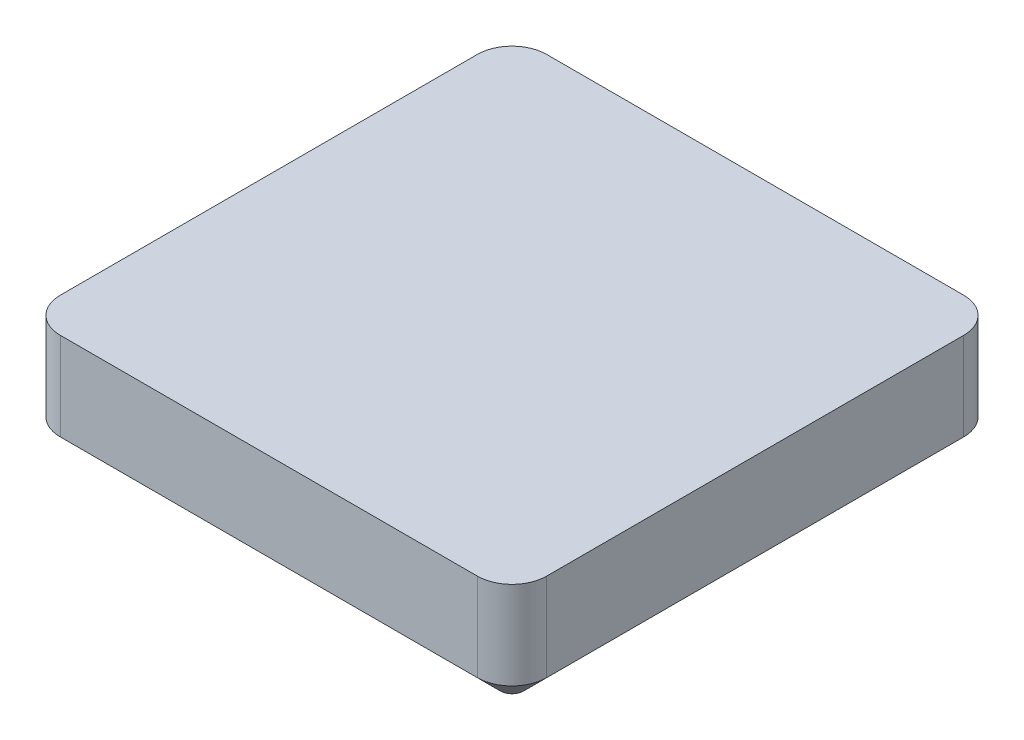
ISO-10303-21;
HEADER;
FILE_DESCRIPTION(('STEP AP214'),'2;1');
FILE_NAME('part.step','',(''),(''),'','','');
FILE_SCHEMA(('AUTOMOTIVE_DESIGN { 1 0 10303 214 1 1 1 1 }'));
ENDSEC;
DATA;
#1=APPLICATION_CONTEXT('core data for automotive mechanical design processes');
#2=APPLICATION_PROTOCOL_DEFINITION('international standard','automotive_design',2000,#1);
#3=PRODUCT_CONTEXT('',#1,'mechanical');
#4=PRODUCT('Part','Part','',(#3));
#5=PRODUCT_RELATED_PRODUCT_CATEGORY('part','',(#4));
#6=PRODUCT_DEFINITION_FORMATION('','',#4);
#7=PRODUCT_DEFINITION_CONTEXT('part definition',#1,'design');
#8=PRODUCT_DEFINITION('design','',#6,#7);
#9=PRODUCT_DEFINITION_SHAPE('','',#8);
#10=(LENGTH_UNIT() NAMED_UNIT(*) SI_UNIT(.MILLI.,.METRE.));
#11=(NAMED_UNIT(*) PLANE_ANGLE_UNIT() SI_UNIT($,.RADIAN.));
#12=(NAMED_UNIT(*) SI_UNIT($,.STERADIAN.) SOLID_ANGLE_UNIT());
#13=UNCERTAINTY_MEASURE_WITH_UNIT(LENGTH_MEASURE(1.E-05),#10,'distance_accuracy_value','');
#14=(GEOMETRIC_REPRESENTATION_CONTEXT(3) GLOBAL_UNCERTAINTY_ASSIGNED_CONTEXT((#13)) GLOBAL_UNIT_ASSIGNED_CONTEXT((#10,
#11,#12)) REPRESENTATION_CONTEXT('',''));
#15=CARTESIAN_POINT('',(0.,0.,0.));
#16=DIRECTION('',(0.,0.,1.));
#17=DIRECTION('',(1.,0.,0.));
#18=AXIS2_PLACEMENT_3D('',#15,#16,#17);
#19=CARTESIAN_POINT('',(0.,48.,0.));
#20=DIRECTION('',(1.,0.,0.));
#21=DIRECTION('',(0.,0.,-1.));
#22=AXIS2_PLACEMENT_3D('',#19,#20,#21);
#23=PLANE('',#22);
#24=DIRECTION('',(0.,-1.,0.));
#25=VECTOR('',#24,1.);
#26=CARTESIAN_POINT('',(0.,48.,15.));
#27=LINE('',#26,#25);
#28=CARTESIAN_POINT('',(0.,48.,15.));
#29=VERTEX_POINT('',#28);
#30=CARTESIAN_POINT('',(0.,9.99999999999998,15.));
#31=VERTEX_POINT('',#30);
#32=EDGE_CURVE('E138',#29,#31,#27,.T.);
#33=ORIENTED_EDGE('',*,*,#32,.T.);
#34=DIRECTION('',(0.,0.,1.));
#35=VECTOR('',#34,1.);
#36=CARTESIAN_POINT('',(0.,9.99999999999998,0.));
#37=LINE('',#36,#35);
#38=CARTESIAN_POINT('',(0.,9.99999999999998,195.));
#39=VERTEX_POINT('',#38);
#40=EDGE_CURVE('E11',#31,#39,#37,.T.);
#41=ORIENTED_EDGE('',*,*,#40,.T.);
#42=DIRECTION('',(0.,-1.,0.));
#43=VECTOR('',#42,1.);
#44=CARTESIAN_POINT('',(0.,48.,195.));
#45=LINE('',#44,#43);
#46=CARTESIAN_POINT('',(0.,48.,195.));
#47=VERTEX_POINT('',#46);
#48=EDGE_CURVE('E139',#39,#47,#45,.F.);
#49=ORIENTED_EDGE('',*,*,#48,.T.);
#50=DIRECTION('',(0.,0.,1.));
#51=VECTOR('',#50,1.);
#52=CARTESIAN_POINT('',(0.,48.,0.));
#53=LINE('',#52,#51);
#54=EDGE_CURVE('E131',#29,#47,#53,.T.);
#55=ORIENTED_EDGE('',*,*,#54,.F.);
#56=EDGE_LOOP('',(#33,#41,#49,#55));
#57=FACE_BOUND('',#56,.T.);
#58=ADVANCED_FACE('F35',(#57),#23,.F.);
#59=CARTESIAN_POINT('',(0.,48.,210.));
#60=DIRECTION('',(0.,0.,-1.));
#61=DIRECTION('',(-1.,0.,0.));
#62=AXIS2_PLACEMENT_3D('',#59,#60,#61);
#63=PLANE('',#62);
#64=DIRECTION('',(0.,-1.,0.));
#65=VECTOR('',#64,1.);
#66=CARTESIAN_POINT('',(15.,48.,210.));
#67=LINE('',#66,#65);
#68=CARTESIAN_POINT('',(15.,48.,210.));
#69=VERTEX_POINT('',#68);
#70=CARTESIAN_POINT('',(15.,9.99999999999998,210.));
#71=VERTEX_POINT('',#70);
#72=EDGE_CURVE('E161',#69,#71,#67,.T.);
#73=ORIENTED_EDGE('',*,*,#72,.T.);
#74=DIRECTION('',(1.,0.,0.));
#75=VECTOR('',#74,1.);
#76=CARTESIAN_POINT('',(0.,9.99999999999998,210.));
#77=LINE('',#76,#75);
#78=CARTESIAN_POINT('',(195.,9.99999999999998,210.));
#79=VERTEX_POINT('',#78);
#80=EDGE_CURVE('E192',#71,#79,#77,.T.);
#81=ORIENTED_EDGE('',*,*,#80,.T.);
#82=DIRECTION('',(0.,-1.,0.));
#83=VECTOR('',#82,1.);
#84=CARTESIAN_POINT('',(195.,48.,210.));
#85=LINE('',#84,#83);
#86=CARTESIAN_POINT('',(195.,48.,210.));
#87=VERTEX_POINT('',#86);
#88=EDGE_CURVE('E164',#79,#87,#85,.F.);
#89=ORIENTED_EDGE('',*,*,#88,.T.);
#90=DIRECTION('',(1.,0.,0.));
#91=VECTOR('',#90,1.);
#92=CARTESIAN_POINT('',(0.,48.,210.));
#93=LINE('',#92,#91);
#94=EDGE_CURVE('E140',#69,#87,#93,.T.);
#95=ORIENTED_EDGE('',*,*,#94,.F.);
#96=EDGE_LOOP('',(#73,#81,#89,#95));
#97=FACE_BOUND('',#96,.T.);
#98=ADVANCED_FACE('F257',(#97),#63,.F.);
#99=CARTESIAN_POINT('',(210.,48.,0.));
#100=DIRECTION('',(-1.,0.,0.));
#101=DIRECTION('',(0.,0.,1.));
#102=AXIS2_PLACEMENT_3D('',#99,#100,#101);
#103=PLANE('',#102);
#104=DIRECTION('',(0.,-1.,0.));
#105=VECTOR('',#104,1.);
#106=CARTESIAN_POINT('',(210.,48.,195.));
#107=LINE('',#106,#105);
#108=CARTESIAN_POINT('',(210.,48.,195.));
#109=VERTEX_POINT('',#108);
#110=CARTESIAN_POINT('',(210.,9.99999999999998,195.));
#111=VERTEX_POINT('',#110);
#112=EDGE_CURVE('E135',#109,#111,#107,.T.);
#113=ORIENTED_EDGE('',*,*,#112,.T.);
#114=DIRECTION('',(0.,0.,-1.));
#115=VECTOR('',#114,1.);
#116=CARTESIAN_POINT('',(210.,9.99999999999998,0.));
#117=LINE('',#116,#115);
#118=CARTESIAN_POINT('',(210.,9.99999999999998,15.));
#119=VERTEX_POINT('',#118);
#120=EDGE_CURVE('E166',#111,#119,#117,.T.);
#121=ORIENTED_EDGE('',*,*,#120,.T.);
#122=DIRECTION('',(0.,-1.,0.));
#123=VECTOR('',#122,1.);
#124=CARTESIAN_POINT('',(210.,48.,15.));
#125=LINE('',#124,#123);
#126=CARTESIAN_POINT('',(210.,48.,15.));
#127=VERTEX_POINT('',#126);
#128=EDGE_CURVE('E159',#119,#127,#125,.F.);
#129=ORIENTED_EDGE('',*,*,#128,.T.);
#130=DIRECTION('',(0.,0.,-1.));
#131=VECTOR('',#130,1.);
#132=CARTESIAN_POINT('',(210.,48.,0.));
#133=LINE('',#132,#131);
#134=EDGE_CURVE('E249',#109,#127,#133,.T.);
#135=ORIENTED_EDGE('',*,*,#134,.F.);
#136=EDGE_LOOP('',(#113,#121,#129,#135));
#137=FACE_BOUND('',#136,.T.);
#138=ADVANCED_FACE('F246',(#137),#103,.F.);
#139=CARTESIAN_POINT('',(0.,48.,0.));
#140=DIRECTION('',(0.,0.,1.));
#141=DIRECTION('',(1.,0.,0.));
#142=AXIS2_PLACEMENT_3D('',#139,#140,#141);
#143=PLANE('',#142);
#144=DIRECTION('',(0.,-1.,0.));
#145=VECTOR('',#144,1.);
#146=CARTESIAN_POINT('',(195.,48.,0.));
#147=LINE('',#146,#145);
#148=CARTESIAN_POINT('',(195.,48.,0.));
#149=VERTEX_POINT('',#148);
#150=CARTESIAN_POINT('',(195.,9.99999999999998,0.));
#151=VERTEX_POINT('',#150);
#152=EDGE_CURVE('E143',#149,#151,#147,.T.);
#153=ORIENTED_EDGE('',*,*,#152,.T.);
#154=DIRECTION('',(-1.,0.,0.));
#155=VECTOR('',#154,1.);
#156=CARTESIAN_POINT('',(0.,9.99999999999998,0.));
#157=LINE('',#156,#155);
#158=CARTESIAN_POINT('',(15.,9.99999999999998,0.));
#159=VERTEX_POINT('',#158);
#160=EDGE_CURVE('E190',#151,#159,#157,.T.);
#161=ORIENTED_EDGE('',*,*,#160,.T.);
#162=DIRECTION('',(0.,-1.,0.));
#163=VECTOR('',#162,1.);
#164=CARTESIAN_POINT('',(15.,48.,0.));
#165=LINE('',#164,#163);
#166=CARTESIAN_POINT('',(15.,48.,0.));
#167=VERTEX_POINT('',#166);
#168=EDGE_CURVE('E146',#159,#167,#165,.F.);
#169=ORIENTED_EDGE('',*,*,#168,.T.);
#170=DIRECTION('',(-1.,0.,0.));
#171=VECTOR('',#170,1.);
#172=CARTESIAN_POINT('',(0.,48.,0.));
#173=LINE('',#172,#171);
#174=EDGE_CURVE('E134',#149,#167,#173,.T.);
#175=ORIENTED_EDGE('',*,*,#174,.F.);
#176=EDGE_LOOP('',(#153,#161,#169,#175));
#177=FACE_BOUND('',#176,.T.);
#178=ADVANCED_FACE('F286',(#177),#143,.F.);
#179=CARTESIAN_POINT('',(0.,48.,0.));
#180=DIRECTION('',(0.,1.,0.));
#181=DIRECTION('',(0.,0.,1.));
#182=AXIS2_PLACEMENT_3D('',#179,#180,#181);
#183=PLANE('',#182);
#184=ORIENTED_EDGE('',*,*,#174,.T.);
#185=CARTESIAN_POINT('',(15.,48.,15.));
#186=DIRECTION('',(0.,1.,0.));
#187=DIRECTION('',(0.,0.,1.));
#188=AXIS2_PLACEMENT_3D('',#185,#186,#187);
#189=CIRCLE('',#188,15.);
#190=EDGE_CURVE('E128',#167,#29,#189,.T.);
#191=ORIENTED_EDGE('',*,*,#190,.T.);
#192=ORIENTED_EDGE('',*,*,#54,.T.);
#193=CARTESIAN_POINT('',(15.,48.,195.));
#194=DIRECTION('',(0.,1.,0.));
#195=DIRECTION('',(0.,0.,1.));
#196=AXIS2_PLACEMENT_3D('',#193,#194,#195);
#197=CIRCLE('',#196,15.);
#198=EDGE_CURVE('E152',#47,#69,#197,.T.);
#199=ORIENTED_EDGE('',*,*,#198,.T.);
#200=ORIENTED_EDGE('',*,*,#94,.T.);
#201=CARTESIAN_POINT('',(195.,48.,195.));
#202=DIRECTION('',(0.,1.,0.));
#203=DIRECTION('',(0.,0.,1.));
#204=AXIS2_PLACEMENT_3D('',#201,#202,#203);
#205=CIRCLE('',#204,15.);
#206=EDGE_CURVE('E154',#87,#109,#205,.T.);
#207=ORIENTED_EDGE('',*,*,#206,.T.);
#208=ORIENTED_EDGE('',*,*,#134,.T.);
#209=CARTESIAN_POINT('',(195.,48.,15.));
#210=DIRECTION('',(0.,1.,0.));
#211=DIRECTION('',(0.,0.,1.));
#212=AXIS2_PLACEMENT_3D('',#209,#210,#211);
#213=CIRCLE('',#212,15.);
#214=EDGE_CURVE('E136',#127,#149,#213,.T.);
#215=ORIENTED_EDGE('',*,*,#214,.T.);
#216=EDGE_LOOP('',(#184,#191,#192,#199,#200,#207,#208,#215));
#217=FACE_BOUND('',#216,.T.);
#218=ADVANCED_FACE('F130',(#217),#183,.T.);
#219=CARTESIAN_POINT('',(0.,0.,0.));
#220=DIRECTION('',(0.,1.,0.));
#221=DIRECTION('',(0.,0.,1.));
#222=AXIS2_PLACEMENT_3D('',#219,#220,#221);
#223=PLANE('',#222);
#224=CARTESIAN_POINT('',(195.,0.,15.));
#225=DIRECTION('',(0.,1.,0.));
#226=DIRECTION('',(0.,0.,1.));
#227=AXIS2_PLACEMENT_3D('',#224,#225,#226);
#228=CIRCLE('',#227,4.99999999999998);
#229=CARTESIAN_POINT('',(195.,0.,10.));
#230=VERTEX_POINT('',#229);
#231=CARTESIAN_POINT('',(200.,0.,15.));
#232=VERTEX_POINT('',#231);
#233=EDGE_CURVE('E181',#230,#232,#228,.F.);
#234=ORIENTED_EDGE('',*,*,#233,.T.);
#235=DIRECTION('',(0.,0.,1.));
#236=VECTOR('',#235,1.);
#237=CARTESIAN_POINT('',(200.,0.,0.));
#238=LINE('',#237,#236);
#239=CARTESIAN_POINT('',(200.,0.,195.));
#240=VERTEX_POINT('',#239);
#241=EDGE_CURVE('E183',#232,#240,#238,.T.);
#242=ORIENTED_EDGE('',*,*,#241,.T.);
#243=CARTESIAN_POINT('',(195.,0.,195.));
#244=DIRECTION('',(0.,1.,0.));
#245=DIRECTION('',(0.,0.,1.));
#246=AXIS2_PLACEMENT_3D('',#243,#244,#245);
#247=CIRCLE('',#246,4.99999999999998);
#248=CARTESIAN_POINT('',(195.,0.,200.));
#249=VERTEX_POINT('',#248);
#250=EDGE_CURVE('E179',#240,#249,#247,.F.);
#251=ORIENTED_EDGE('',*,*,#250,.T.);
#252=DIRECTION('',(-1.,0.,0.));
#253=VECTOR('',#252,1.);
#254=CARTESIAN_POINT('',(0.,0.,200.));
#255=LINE('',#254,#253);
#256=CARTESIAN_POINT('',(15.,0.,200.));
#257=VERTEX_POINT('',#256);
#258=EDGE_CURVE('E175',#249,#257,#255,.T.);
#259=ORIENTED_EDGE('',*,*,#258,.T.);
#260=CARTESIAN_POINT('',(15.,0.,195.));
#261=DIRECTION('',(0.,1.,0.));
#262=DIRECTION('',(0.,0.,1.));
#263=AXIS2_PLACEMENT_3D('',#260,#261,#262);
#264=CIRCLE('',#263,4.99999999999999);
#265=CARTESIAN_POINT('',(10.,0.,195.));
#266=VERTEX_POINT('',#265);
#267=EDGE_CURVE('E171',#257,#266,#264,.F.);
#268=ORIENTED_EDGE('',*,*,#267,.T.);
#269=DIRECTION('',(0.,0.,-1.));
#270=VECTOR('',#269,1.);
#271=CARTESIAN_POINT('',(10.,0.,0.));
#272=LINE('',#271,#270);
#273=CARTESIAN_POINT('',(10.,0.,15.));
#274=VERTEX_POINT('',#273);
#275=EDGE_CURVE('E169',#266,#274,#272,.T.);
#276=ORIENTED_EDGE('',*,*,#275,.T.);
#277=CARTESIAN_POINT('',(15.,0.,15.));
#278=DIRECTION('',(0.,1.,0.));
#279=DIRECTION('',(0.,0.,1.));
#280=AXIS2_PLACEMENT_3D('',#277,#278,#279);
#281=CIRCLE('',#280,4.99999999999999);
#282=CARTESIAN_POINT('',(15.,0.,10.));
#283=VERTEX_POINT('',#282);
#284=EDGE_CURVE('E173',#274,#283,#281,.F.);
#285=ORIENTED_EDGE('',*,*,#284,.T.);
#286=DIRECTION('',(1.,0.,0.));
#287=VECTOR('',#286,1.);
#288=CARTESIAN_POINT('',(0.,0.,10.));
#289=LINE('',#288,#287);
#290=EDGE_CURVE('E177',#283,#230,#289,.T.);
#291=ORIENTED_EDGE('',*,*,#290,.T.);
#292=EDGE_LOOP('',(#234,#242,#251,#259,#268,#276,#285,#291));
#293=FACE_BOUND('',#292,.T.);
#294=ADVANCED_FACE('F226',(#293),#223,.F.);
#295=CARTESIAN_POINT('',(15.,48.,15.));
#296=DIRECTION('',(0.,-1.,0.));
#297=DIRECTION('',(0.,0.,-1.));
#298=AXIS2_PLACEMENT_3D('',#295,#296,#297);
#299=CYLINDRICAL_SURFACE('',#298,15.);
#300=ORIENTED_EDGE('',*,*,#168,.F.);
#301=CARTESIAN_POINT('',(15.,9.99999999999998,15.));
#302=DIRECTION('',(0.,1.,0.));
#303=DIRECTION('',(0.,0.,1.));
#304=AXIS2_PLACEMENT_3D('',#301,#302,#303);
#305=CIRCLE('',#304,15.);
#306=EDGE_CURVE('E59',#159,#31,#305,.T.);
#307=ORIENTED_EDGE('',*,*,#306,.T.);
#308=ORIENTED_EDGE('',*,*,#32,.F.);
#309=ORIENTED_EDGE('',*,*,#190,.F.);
#310=EDGE_LOOP('',(#300,#307,#308,#309));
#311=FACE_BOUND('',#310,.T.);
#312=ADVANCED_FACE('F142',(#311),#299,.T.);
#313=CARTESIAN_POINT('',(195.,48.,15.));
#314=DIRECTION('',(0.,-1.,0.));
#315=DIRECTION('',(0.,0.,-1.));
#316=AXIS2_PLACEMENT_3D('',#313,#314,#315);
#317=CYLINDRICAL_SURFACE('',#316,15.);
#318=ORIENTED_EDGE('',*,*,#128,.F.);
#319=CARTESIAN_POINT('',(195.,9.99999999999998,15.));
#320=DIRECTION('',(0.,1.,0.));
#321=DIRECTION('',(0.,0.,1.));
#322=AXIS2_PLACEMENT_3D('',#319,#320,#321);
#323=CIRCLE('',#322,15.);
#324=EDGE_CURVE('E186',#119,#151,#323,.T.);
#325=ORIENTED_EDGE('',*,*,#324,.T.);
#326=ORIENTED_EDGE('',*,*,#152,.F.);
#327=ORIENTED_EDGE('',*,*,#214,.F.);
#328=EDGE_LOOP('',(#318,#325,#326,#327));
#329=FACE_BOUND('',#328,.T.);
#330=ADVANCED_FACE('F266',(#329),#317,.T.);
#331=CARTESIAN_POINT('',(195.,48.,195.));
#332=DIRECTION('',(0.,-1.,0.));
#333=DIRECTION('',(0.,0.,-1.));
#334=AXIS2_PLACEMENT_3D('',#331,#332,#333);
#335=CYLINDRICAL_SURFACE('',#334,15.);
#336=ORIENTED_EDGE('',*,*,#88,.F.);
#337=CARTESIAN_POINT('',(195.,9.99999999999998,195.));
#338=DIRECTION('',(0.,1.,0.));
#339=DIRECTION('',(0.,0.,1.));
#340=AXIS2_PLACEMENT_3D('',#337,#338,#339);
#341=CIRCLE('',#340,15.);
#342=EDGE_CURVE('E188',#79,#111,#341,.T.);
#343=ORIENTED_EDGE('',*,*,#342,.T.);
#344=ORIENTED_EDGE('',*,*,#112,.F.);
#345=ORIENTED_EDGE('',*,*,#206,.F.);
#346=EDGE_LOOP('',(#336,#343,#344,#345));
#347=FACE_BOUND('',#346,.T.);
#348=ADVANCED_FACE('F242',(#347),#335,.T.);
#349=CARTESIAN_POINT('',(15.,48.,195.));
#350=DIRECTION('',(0.,-1.,0.));
#351=DIRECTION('',(0.,0.,-1.));
#352=AXIS2_PLACEMENT_3D('',#349,#350,#351);
#353=CYLINDRICAL_SURFACE('',#352,15.);
#354=ORIENTED_EDGE('',*,*,#48,.F.);
#355=CARTESIAN_POINT('',(15.,9.99999999999998,195.));
#356=DIRECTION('',(0.,1.,0.));
#357=DIRECTION('',(0.,0.,1.));
#358=AXIS2_PLACEMENT_3D('',#355,#356,#357);
#359=CIRCLE('',#358,15.);
#360=EDGE_CURVE('E45',#39,#71,#359,.T.);
#361=ORIENTED_EDGE('',*,*,#360,.T.);
#362=ORIENTED_EDGE('',*,*,#72,.F.);
#363=ORIENTED_EDGE('',*,*,#198,.F.);
#364=EDGE_LOOP('',(#354,#361,#362,#363));
#365=FACE_BOUND('',#364,.T.);
#366=ADVANCED_FACE('F259',(#365),#353,.T.);
#367=CARTESIAN_POINT('',(0.,9.99999999999998,0.));
#368=DIRECTION('',(0.707106781186546,0.707106781186548,0.));
#369=DIRECTION('',(0.,0.,1.));
#370=AXIS2_PLACEMENT_3D('',#367,#368,#369);
#371=PLANE('',#370);
#372=DIRECTION('',(-0.707106781186548,0.707106781186546,0.));
#373=VECTOR('',#372,1.);
#374=CARTESIAN_POINT('',(10.,0.,15.));
#375=LINE('',#374,#373);
#376=EDGE_CURVE('E211',#274,#31,#375,.T.);
#377=ORIENTED_EDGE('',*,*,#376,.F.);
#378=ORIENTED_EDGE('',*,*,#275,.F.);
#379=DIRECTION('',(0.707106781186548,-0.707106781186546,0.));
#380=VECTOR('',#379,1.);
#381=CARTESIAN_POINT('',(0.,9.99999999999998,195.));
#382=LINE('',#381,#380);
#383=EDGE_CURVE('E40',#39,#266,#382,.T.);
#384=ORIENTED_EDGE('',*,*,#383,.F.);
#385=ORIENTED_EDGE('',*,*,#40,.F.);
#386=EDGE_LOOP('',(#377,#378,#384,#385));
#387=FACE_BOUND('',#386,.T.);
#388=ADVANCED_FACE('F38',(#387),#371,.F.);
#389=CARTESIAN_POINT('',(15.,0.,195.));
#390=DIRECTION('',(0.,1.,0.));
#391=DIRECTION('',(0.,0.,1.));
#392=AXIS2_PLACEMENT_3D('',#389,#390,#391);
#393=CONICAL_SURFACE('',#392,4.99999999999999,0.78539816339745);
#394=ORIENTED_EDGE('',*,*,#383,.T.);
#395=ORIENTED_EDGE('',*,*,#267,.F.);
#396=DIRECTION('',(0.,-0.707106781186546,-0.707106781186549));
#397=VECTOR('',#396,1.);
#398=CARTESIAN_POINT('',(15.,9.99999999999998,210.));
#399=LINE('',#398,#397);
#400=EDGE_CURVE('E209',#71,#257,#399,.T.);
#401=ORIENTED_EDGE('',*,*,#400,.F.);
#402=ORIENTED_EDGE('',*,*,#360,.F.);
#403=EDGE_LOOP('',(#394,#395,#401,#402));
#404=FACE_BOUND('',#403,.T.);
#405=ADVANCED_FACE('F221',(#404),#393,.T.);
#406=CARTESIAN_POINT('',(15.,0.,15.));
#407=DIRECTION('',(0.,1.,0.));
#408=DIRECTION('',(0.,0.,1.));
#409=AXIS2_PLACEMENT_3D('',#406,#407,#408);
#410=CONICAL_SURFACE('',#409,4.99999999999999,0.78539816339745);
#411=ORIENTED_EDGE('',*,*,#376,.T.);
#412=ORIENTED_EDGE('',*,*,#306,.F.);
#413=DIRECTION('',(0.,0.707106781186547,-0.707106781186548));
#414=VECTOR('',#413,1.);
#415=CARTESIAN_POINT('',(15.,0.,10.));
#416=LINE('',#415,#414);
#417=EDGE_CURVE('E206',#283,#159,#416,.T.);
#418=ORIENTED_EDGE('',*,*,#417,.F.);
#419=ORIENTED_EDGE('',*,*,#284,.F.);
#420=EDGE_LOOP('',(#411,#412,#418,#419));
#421=FACE_BOUND('',#420,.T.);
#422=ADVANCED_FACE('F288',(#421),#410,.T.);
#423=CARTESIAN_POINT('',(0.,9.99999999999998,210.));
#424=DIRECTION('',(0.,0.707106781186548,-0.707106781186546));
#425=DIRECTION('',(1.,0.,0.));
#426=AXIS2_PLACEMENT_3D('',#423,#424,#425);
#427=PLANE('',#426);
#428=ORIENTED_EDGE('',*,*,#400,.T.);
#429=ORIENTED_EDGE('',*,*,#258,.F.);
#430=DIRECTION('',(0.,-0.707106781186546,-0.707106781186548));
#431=VECTOR('',#430,1.);
#432=CARTESIAN_POINT('',(195.,9.99999999999998,210.));
#433=LINE('',#432,#431);
#434=EDGE_CURVE('E203',#79,#249,#433,.T.);
#435=ORIENTED_EDGE('',*,*,#434,.F.);
#436=ORIENTED_EDGE('',*,*,#80,.F.);
#437=EDGE_LOOP('',(#428,#429,#435,#436));
#438=FACE_BOUND('',#437,.T.);
#439=ADVANCED_FACE('F232',(#438),#427,.F.);
#440=CARTESIAN_POINT('',(0.,9.99999999999998,0.));
#441=DIRECTION('',(0.,0.707106781186548,0.707106781186546));
#442=DIRECTION('',(-1.,0.,0.));
#443=AXIS2_PLACEMENT_3D('',#440,#441,#442);
#444=PLANE('',#443);
#445=ORIENTED_EDGE('',*,*,#417,.T.);
#446=ORIENTED_EDGE('',*,*,#160,.F.);
#447=DIRECTION('',(0.,0.707106781186546,-0.707106781186548));
#448=VECTOR('',#447,1.);
#449=CARTESIAN_POINT('',(195.,0.,10.));
#450=LINE('',#449,#448);
#451=EDGE_CURVE('E200',#230,#151,#450,.T.);
#452=ORIENTED_EDGE('',*,*,#451,.F.);
#453=ORIENTED_EDGE('',*,*,#290,.F.);
#454=EDGE_LOOP('',(#445,#446,#452,#453));
#455=FACE_BOUND('',#454,.T.);
#456=ADVANCED_FACE('F291',(#455),#444,.F.);
#457=CARTESIAN_POINT('',(195.,0.,195.));
#458=DIRECTION('',(0.,1.,0.));
#459=DIRECTION('',(0.,0.,1.));
#460=AXIS2_PLACEMENT_3D('',#457,#458,#459);
#461=CONICAL_SURFACE('',#460,4.99999999999998,0.78539816339745);
#462=ORIENTED_EDGE('',*,*,#434,.T.);
#463=ORIENTED_EDGE('',*,*,#250,.F.);
#464=DIRECTION('',(-0.707106781186548,-0.707106781186547,0.));
#465=VECTOR('',#464,1.);
#466=CARTESIAN_POINT('',(210.,9.99999999999998,195.));
#467=LINE('',#466,#465);
#468=EDGE_CURVE('E198',#111,#240,#467,.T.);
#469=ORIENTED_EDGE('',*,*,#468,.F.);
#470=ORIENTED_EDGE('',*,*,#342,.F.);
#471=EDGE_LOOP('',(#462,#463,#469,#470));
#472=FACE_BOUND('',#471,.T.);
#473=ADVANCED_FACE('F236',(#472),#461,.T.);
#474=CARTESIAN_POINT('',(195.,0.,15.));
#475=DIRECTION('',(0.,1.,0.));
#476=DIRECTION('',(0.,0.,1.));
#477=AXIS2_PLACEMENT_3D('',#474,#475,#476);
#478=CONICAL_SURFACE('',#477,4.99999999999998,0.78539816339745);
#479=ORIENTED_EDGE('',*,*,#451,.T.);
#480=ORIENTED_EDGE('',*,*,#324,.F.);
#481=DIRECTION('',(0.707106781186549,0.707106781186546,0.));
#482=VECTOR('',#481,1.);
#483=CARTESIAN_POINT('',(200.,0.,15.));
#484=LINE('',#483,#482);
#485=EDGE_CURVE('E196',#232,#119,#484,.T.);
#486=ORIENTED_EDGE('',*,*,#485,.F.);
#487=ORIENTED_EDGE('',*,*,#233,.F.);
#488=EDGE_LOOP('',(#479,#480,#486,#487));
#489=FACE_BOUND('',#488,.T.);
#490=ADVANCED_FACE('F299',(#489),#478,.T.);
#491=CARTESIAN_POINT('',(210.,9.99999999999998,0.));
#492=DIRECTION('',(-0.707106781186546,0.707106781186548,0.));
#493=DIRECTION('',(0.,0.,-1.));
#494=AXIS2_PLACEMENT_3D('',#491,#492,#493);
#495=PLANE('',#494);
#496=ORIENTED_EDGE('',*,*,#468,.T.);
#497=ORIENTED_EDGE('',*,*,#241,.F.);
#498=ORIENTED_EDGE('',*,*,#485,.T.);
#499=ORIENTED_EDGE('',*,*,#120,.F.);
#500=EDGE_LOOP('',(#496,#497,#498,#499));
#501=FACE_BOUND('',#500,.T.);
#502=ADVANCED_FACE('F298',(#501),#495,.F.);
#503=CLOSED_SHELL('',(#58,#98,#138,#178,#218,#294,#312,#330,#348,#366,#388,#405,#422,#439,#456,
#473,#490,#502));
#504=MANIFOLD_SOLID_BREP('B2',#503);
#505=ADVANCED_BREP_SHAPE_REPRESENTATION('',(#18,#504),#14);
#506=SHAPE_DEFINITION_REPRESENTATION(#9,#505);
ENDSEC;
END-ISO-10303-21;
